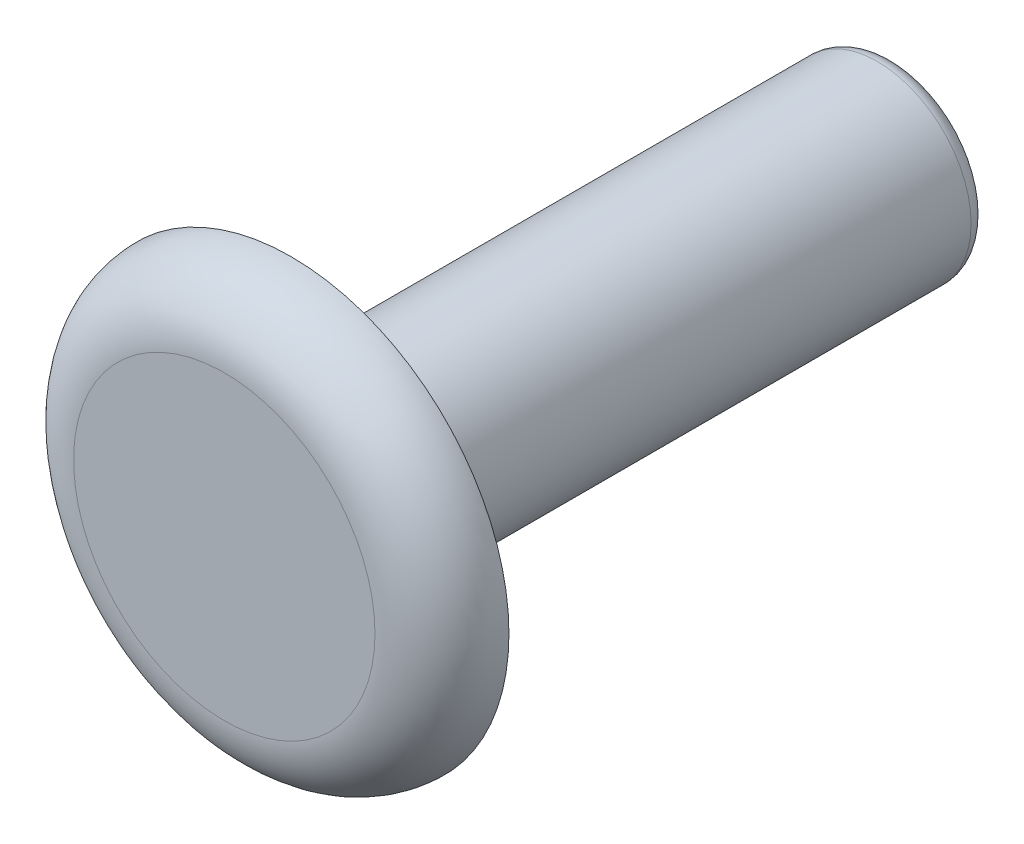
ISO-10303-21;
HEADER;
FILE_DESCRIPTION(('STEP AP214'),'2;1');
FILE_NAME('part.step','',(''),(''),'','','');
FILE_SCHEMA(('AUTOMOTIVE_DESIGN { 1 0 10303 214 1 1 1 1 }'));
ENDSEC;
DATA;
#1=APPLICATION_CONTEXT('core data for automotive mechanical design processes');
#2=APPLICATION_PROTOCOL_DEFINITION('international standard','automotive_design',2000,#1);
#3=PRODUCT_CONTEXT('',#1,'mechanical');
#4=PRODUCT('Part','Part','',(#3));
#5=PRODUCT_RELATED_PRODUCT_CATEGORY('part','',(#4));
#6=PRODUCT_DEFINITION_FORMATION('','',#4);
#7=PRODUCT_DEFINITION_CONTEXT('part definition',#1,'design');
#8=PRODUCT_DEFINITION('design','',#6,#7);
#9=PRODUCT_DEFINITION_SHAPE('','',#8);
#10=(LENGTH_UNIT() NAMED_UNIT(*) SI_UNIT(.MILLI.,.METRE.));
#11=(NAMED_UNIT(*) PLANE_ANGLE_UNIT() SI_UNIT($,.RADIAN.));
#12=(NAMED_UNIT(*) SI_UNIT($,.STERADIAN.) SOLID_ANGLE_UNIT());
#13=UNCERTAINTY_MEASURE_WITH_UNIT(LENGTH_MEASURE(1.E-05),#10,'distance_accuracy_value','');
#14=(GEOMETRIC_REPRESENTATION_CONTEXT(3) GLOBAL_UNCERTAINTY_ASSIGNED_CONTEXT((#13)) GLOBAL_UNIT_ASSIGNED_CONTEXT((#10,
#11,#12)) REPRESENTATION_CONTEXT('',''));
#15=CARTESIAN_POINT('',(0.,0.,0.));
#16=DIRECTION('',(0.,0.,1.));
#17=DIRECTION('',(1.,0.,0.));
#18=AXIS2_PLACEMENT_3D('',#15,#16,#17);
#19=CARTESIAN_POINT('',(-28.0682567910714,21.8847009830465,9.));
#20=DIRECTION('',(0.,0.,-1.));
#21=DIRECTION('',(-1.,0.,0.));
#22=AXIS2_PLACEMENT_3D('',#19,#20,#21);
#23=CYLINDRICAL_SURFACE('',#22,1.4);
#24=CARTESIAN_POINT('',(-28.0682567910714,21.8847009830465,0.25));
#25=DIRECTION('',(0.,0.,1.));
#26=DIRECTION('',(1.,0.,0.));
#27=AXIS2_PLACEMENT_3D('',#24,#25,#26);
#28=CIRCLE('',#27,1.4);
#29=CARTESIAN_POINT('',(-26.6682567910714,21.8847009830465,0.25));
#30=VERTEX_POINT('',#29);
#31=EDGE_CURVE('E42',#30,#30,#28,.T.);
#32=ORIENTED_EDGE('',*,*,#31,.T.);
#33=EDGE_LOOP('',(#32));
#34=FACE_BOUND('',#33,.T.);
#35=CARTESIAN_POINT('',(-28.0682567910714,21.8847009830465,9.));
#36=DIRECTION('',(0.,0.,1.));
#37=DIRECTION('',(1.,0.,0.));
#38=AXIS2_PLACEMENT_3D('',#35,#36,#37);
#39=CIRCLE('',#38,1.4);
#40=CARTESIAN_POINT('',(-26.6682567910714,21.8847009830465,9.));
#41=VERTEX_POINT('',#40);
#42=EDGE_CURVE('E50',#41,#41,#39,.T.);
#43=ORIENTED_EDGE('',*,*,#42,.F.);
#44=EDGE_LOOP('',(#43));
#45=FACE_BOUND('',#44,.T.);
#46=ADVANCED_FACE('F35',(#34,#45),#23,.T.);
#47=CARTESIAN_POINT('',(-28.0682567910714,21.8847009830465,0.));
#48=DIRECTION('',(0.,0.,1.));
#49=DIRECTION('',(1.,0.,0.));
#50=AXIS2_PLACEMENT_3D('',#47,#48,#49);
#51=PLANE('',#50);
#52=CARTESIAN_POINT('',(-28.0682567910714,21.8847009830465,0.));
#53=DIRECTION('',(0.,0.,1.));
#54=DIRECTION('',(1.,0.,0.));
#55=AXIS2_PLACEMENT_3D('',#52,#53,#54);
#56=CIRCLE('',#55,1.15);
#57=CARTESIAN_POINT('',(-26.9182567910714,21.8847009830465,0.));
#58=VERTEX_POINT('',#57);
#59=EDGE_CURVE('E10',#58,#58,#56,.F.);
#60=ORIENTED_EDGE('',*,*,#59,.T.);
#61=EDGE_LOOP('',(#60));
#62=FACE_BOUND('',#61,.T.);
#63=ADVANCED_FACE('F71',(#62),#51,.F.);
#64=CARTESIAN_POINT('',(-28.0682567910714,21.8847009830465,10.));
#65=DIRECTION('',(0.,0.,1.));
#66=DIRECTION('',(1.,0.,0.));
#67=AXIS2_PLACEMENT_3D('',#64,#65,#66);
#68=PLANE('',#67);
#69=CARTESIAN_POINT('',(-28.0682567910714,21.8847009830465,10.));
#70=DIRECTION('',(0.,0.,1.));
#71=DIRECTION('',(1.,0.,0.));
#72=AXIS2_PLACEMENT_3D('',#69,#70,#71);
#73=CIRCLE('',#72,2.25);
#74=CARTESIAN_POINT('',(-25.8182567910714,21.8847009830465,10.));
#75=VERTEX_POINT('',#74);
#76=EDGE_CURVE('E46',#75,#75,#73,.T.);
#77=ORIENTED_EDGE('',*,*,#76,.T.);
#78=EDGE_LOOP('',(#77));
#79=FACE_BOUND('',#78,.T.);
#80=ADVANCED_FACE('F64',(#79),#68,.T.);
#81=CARTESIAN_POINT('',(-28.0682567910714,21.8847009830465,9.));
#82=DIRECTION('',(0.,0.,1.));
#83=DIRECTION('',(1.,0.,0.));
#84=AXIS2_PLACEMENT_3D('',#81,#82,#83);
#85=PLANE('',#84);
#86=ORIENTED_EDGE('',*,*,#42,.T.);
#87=EDGE_LOOP('',(#86));
#88=FACE_BOUND('',#87,.T.);
#89=CARTESIAN_POINT('',(-28.0682567910714,21.8847009830465,9.));
#90=DIRECTION('',(0.,0.,1.));
#91=DIRECTION('',(1.,0.,0.));
#92=AXIS2_PLACEMENT_3D('',#89,#90,#91);
#93=CIRCLE('',#92,3.25);
#94=CARTESIAN_POINT('',(-24.8182567910714,21.8847009830465,9.));
#95=VERTEX_POINT('',#94);
#96=EDGE_CURVE('E55',#95,#95,#93,.T.);
#97=ORIENTED_EDGE('',*,*,#96,.F.);
#98=EDGE_LOOP('',(#97));
#99=FACE_BOUND('',#98,.T.);
#100=ADVANCED_FACE('F62',(#88,#99),#85,.F.);
#101=CARTESIAN_POINT('',(-28.0682567910714,21.8847009830465,9.));
#102=DIRECTION('',(0.,0.,1.));
#103=DIRECTION('',(1.,0.,0.));
#104=AXIS2_PLACEMENT_3D('',#101,#102,#103);
#105=TOROIDAL_SURFACE('',#104,2.25,1.);
#106=ORIENTED_EDGE('',*,*,#96,.T.);
#107=EDGE_LOOP('',(#106));
#108=FACE_BOUND('',#107,.T.);
#109=ORIENTED_EDGE('',*,*,#76,.F.);
#110=EDGE_LOOP('',(#109));
#111=FACE_BOUND('',#110,.T.);
#112=ADVANCED_FACE('F59',(#108,#111),#105,.T.);
#113=CARTESIAN_POINT('',(-28.0682567910714,21.8847009830465,0.25));
#114=DIRECTION('',(0.,0.,1.));
#115=DIRECTION('',(1.,0.,0.));
#116=AXIS2_PLACEMENT_3D('',#113,#114,#115);
#117=TOROIDAL_SURFACE('',#116,1.15,0.25);
#118=ORIENTED_EDGE('',*,*,#59,.F.);
#119=EDGE_LOOP('',(#118));
#120=FACE_BOUND('',#119,.T.);
#121=ORIENTED_EDGE('',*,*,#31,.F.);
#122=EDGE_LOOP('',(#121));
#123=FACE_BOUND('',#122,.T.);
#124=ADVANCED_FACE('F37',(#120,#123),#117,.T.);
#125=CLOSED_SHELL('',(#46,#63,#80,#100,#112,#124));
#126=MANIFOLD_SOLID_BREP('B2',#125);
#127=ADVANCED_BREP_SHAPE_REPRESENTATION('',(#18,#126),#14);
#128=SHAPE_DEFINITION_REPRESENTATION(#9,#127);
ENDSEC;
END-ISO-10303-21;
